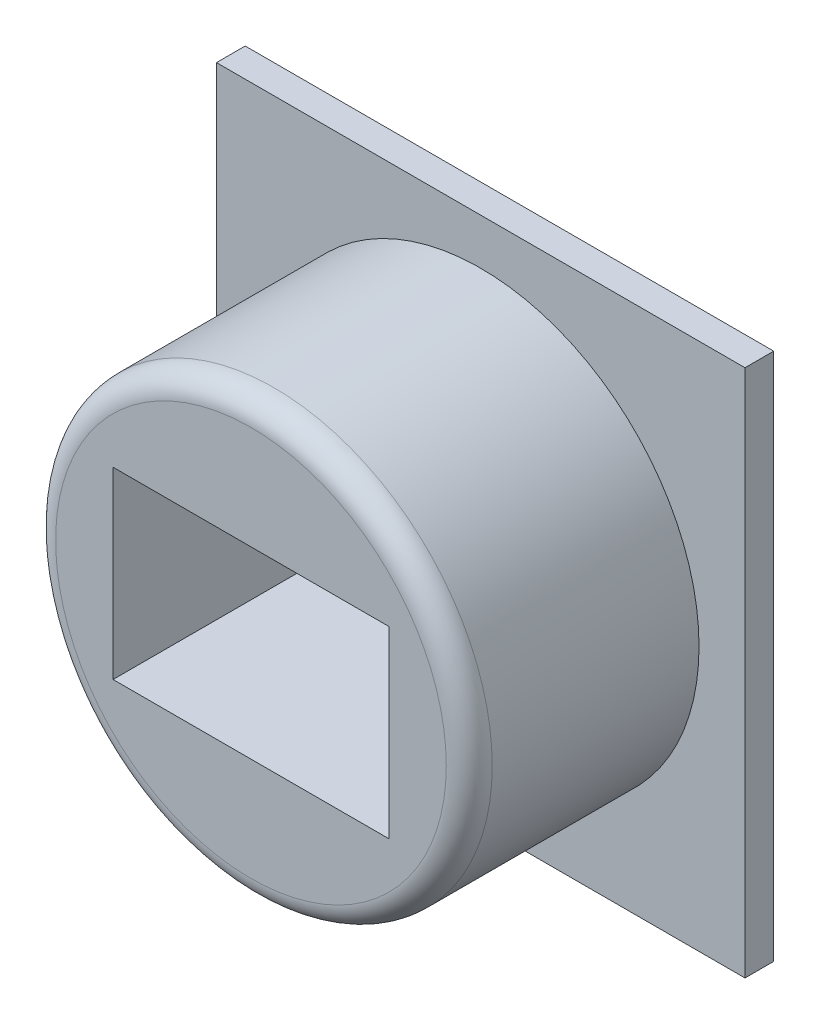
ISO-10303-21;
HEADER;
FILE_DESCRIPTION(('STEP AP214'),'2;1');
FILE_NAME('part.step','',(''),(''),'','','');
FILE_SCHEMA(('AUTOMOTIVE_DESIGN { 1 0 10303 214 1 1 1 1 }'));
ENDSEC;
DATA;
#1=APPLICATION_CONTEXT('core data for automotive mechanical design processes');
#2=APPLICATION_PROTOCOL_DEFINITION('international standard','automotive_design',2000,#1);
#3=PRODUCT_CONTEXT('',#1,'mechanical');
#4=PRODUCT('Part','Part','',(#3));
#5=PRODUCT_RELATED_PRODUCT_CATEGORY('part','',(#4));
#6=PRODUCT_DEFINITION_FORMATION('','',#4);
#7=PRODUCT_DEFINITION_CONTEXT('part definition',#1,'design');
#8=PRODUCT_DEFINITION('design','',#6,#7);
#9=PRODUCT_DEFINITION_SHAPE('','',#8);
#10=(LENGTH_UNIT() NAMED_UNIT(*) SI_UNIT(.MILLI.,.METRE.));
#11=(NAMED_UNIT(*) PLANE_ANGLE_UNIT() SI_UNIT($,.RADIAN.));
#12=(NAMED_UNIT(*) SI_UNIT($,.STERADIAN.) SOLID_ANGLE_UNIT());
#13=UNCERTAINTY_MEASURE_WITH_UNIT(LENGTH_MEASURE(1.E-05),#10,'distance_accuracy_value','');
#14=(GEOMETRIC_REPRESENTATION_CONTEXT(3) GLOBAL_UNCERTAINTY_ASSIGNED_CONTEXT((#13)) GLOBAL_UNIT_ASSIGNED_CONTEXT((#10,
#11,#12)) REPRESENTATION_CONTEXT('',''));
#15=CARTESIAN_POINT('',(0.,0.,0.));
#16=DIRECTION('',(0.,0.,1.));
#17=DIRECTION('',(1.,0.,0.));
#18=AXIS2_PLACEMENT_3D('',#15,#16,#17);
#19=CARTESIAN_POINT('',(0.,0.,4.));
#20=DIRECTION('',(0.,0.,-1.));
#21=DIRECTION('',(-1.,0.,0.));
#22=AXIS2_PLACEMENT_3D('',#19,#20,#21);
#23=CYLINDRICAL_SURFACE('',#22,3.8);
#24=CARTESIAN_POINT('',(0.,0.,3.6));
#25=DIRECTION('',(0.,0.,1.));
#26=DIRECTION('',(1.,0.,0.));
#27=AXIS2_PLACEMENT_3D('',#24,#25,#26);
#28=CIRCLE('',#27,3.8);
#29=CARTESIAN_POINT('',(3.8,0.,3.6));
#30=VERTEX_POINT('',#29);
#31=EDGE_CURVE('E11',#30,#30,#28,.F.);
#32=ORIENTED_EDGE('',*,*,#31,.T.);
#33=EDGE_LOOP('',(#32));
#34=FACE_BOUND('',#33,.T.);
#35=CARTESIAN_POINT('',(0.,0.,0.));
#36=DIRECTION('',(0.,0.,1.));
#37=DIRECTION('',(1.,0.,0.));
#38=AXIS2_PLACEMENT_3D('',#35,#36,#37);
#39=CIRCLE('',#38,3.8);
#40=CARTESIAN_POINT('',(3.8,0.,0.));
#41=VERTEX_POINT('',#40);
#42=EDGE_CURVE('E176',#41,#41,#39,.T.);
#43=ORIENTED_EDGE('',*,*,#42,.T.);
#44=EDGE_LOOP('',(#43));
#45=FACE_BOUND('',#44,.T.);
#46=ADVANCED_FACE('F36',(#34,#45),#23,.T.);
#47=CARTESIAN_POINT('',(0.,0.,4.));
#48=DIRECTION('',(0.,0.,1.));
#49=DIRECTION('',(1.,0.,0.));
#50=AXIS2_PLACEMENT_3D('',#47,#48,#49);
#51=PLANE('',#50);
#52=DIRECTION('',(0.,-1.,0.));
#53=VECTOR('',#52,1.);
#54=CARTESIAN_POINT('',(-2.4,1.6,4.));
#55=LINE('',#54,#53);
#56=CARTESIAN_POINT('',(-2.4,1.6,4.));
#57=VERTEX_POINT('',#56);
#58=CARTESIAN_POINT('',(-2.4,-1.6,4.));
#59=VERTEX_POINT('',#58);
#60=EDGE_CURVE('E51',#57,#59,#55,.T.);
#61=ORIENTED_EDGE('',*,*,#60,.F.);
#62=DIRECTION('',(-1.,0.,0.));
#63=VECTOR('',#62,1.);
#64=CARTESIAN_POINT('',(-2.4,1.6,4.));
#65=LINE('',#64,#63);
#66=CARTESIAN_POINT('',(2.4,1.6,4.));
#67=VERTEX_POINT('',#66);
#68=EDGE_CURVE('E131',#67,#57,#65,.T.);
#69=ORIENTED_EDGE('',*,*,#68,.F.);
#70=DIRECTION('',(0.,1.,0.));
#71=VECTOR('',#70,1.);
#72=CARTESIAN_POINT('',(2.4,1.6,4.));
#73=LINE('',#72,#71);
#74=CARTESIAN_POINT('',(2.4,-1.6,4.));
#75=VERTEX_POINT('',#74);
#76=EDGE_CURVE('E134',#75,#67,#73,.T.);
#77=ORIENTED_EDGE('',*,*,#76,.F.);
#78=DIRECTION('',(1.,0.,0.));
#79=VECTOR('',#78,1.);
#80=CARTESIAN_POINT('',(-2.4,-1.6,4.));
#81=LINE('',#80,#79);
#82=EDGE_CURVE('E143',#59,#75,#81,.T.);
#83=ORIENTED_EDGE('',*,*,#82,.F.);
#84=EDGE_LOOP('',(#61,#69,#77,#83));
#85=FACE_BOUND('',#84,.T.);
#86=CARTESIAN_POINT('',(0.,0.,4.));
#87=DIRECTION('',(0.,0.,1.));
#88=DIRECTION('',(1.,0.,0.));
#89=AXIS2_PLACEMENT_3D('',#86,#87,#88);
#90=CIRCLE('',#89,3.4);
#91=CARTESIAN_POINT('',(3.4,0.,4.));
#92=VERTEX_POINT('',#91);
#93=EDGE_CURVE('E44',#92,#92,#90,.T.);
#94=ORIENTED_EDGE('',*,*,#93,.T.);
#95=EDGE_LOOP('',(#94));
#96=FACE_BOUND('',#95,.T.);
#97=ADVANCED_FACE('F181',(#85,#96),#51,.T.);
#98=CARTESIAN_POINT('',(4.6,4.6,-0.5));
#99=DIRECTION('',(-1.,0.,0.));
#100=DIRECTION('',(0.,-1.,0.));
#101=AXIS2_PLACEMENT_3D('',#98,#99,#100);
#102=PLANE('',#101);
#103=DIRECTION('',(0.,-1.,0.));
#104=VECTOR('',#103,1.);
#105=CARTESIAN_POINT('',(4.6,4.6,0.));
#106=LINE('',#105,#104);
#107=CARTESIAN_POINT('',(4.6,4.6,0.));
#108=VERTEX_POINT('',#107);
#109=CARTESIAN_POINT('',(4.6,-4.6,0.));
#110=VERTEX_POINT('',#109);
#111=EDGE_CURVE('E150',#108,#110,#106,.T.);
#112=ORIENTED_EDGE('',*,*,#111,.T.);
#113=DIRECTION('',(0.,0.,1.));
#114=VECTOR('',#113,1.);
#115=CARTESIAN_POINT('',(4.6,-4.6,-0.5));
#116=LINE('',#115,#114);
#117=CARTESIAN_POINT('',(4.6,-4.6,-0.5));
#118=VERTEX_POINT('',#117);
#119=EDGE_CURVE('E174',#118,#110,#116,.T.);
#120=ORIENTED_EDGE('',*,*,#119,.F.);
#121=DIRECTION('',(0.,-1.,0.));
#122=VECTOR('',#121,1.);
#123=CARTESIAN_POINT('',(4.6,4.6,-0.5));
#124=LINE('',#123,#122);
#125=CARTESIAN_POINT('',(4.6,4.6,-0.5));
#126=VERTEX_POINT('',#125);
#127=EDGE_CURVE('E154',#126,#118,#124,.T.);
#128=ORIENTED_EDGE('',*,*,#127,.F.);
#129=DIRECTION('',(0.,0.,1.));
#130=VECTOR('',#129,1.);
#131=CARTESIAN_POINT('',(4.6,4.6,-0.5));
#132=LINE('',#131,#130);
#133=EDGE_CURVE('E160',#126,#108,#132,.T.);
#134=ORIENTED_EDGE('',*,*,#133,.T.);
#135=EDGE_LOOP('',(#112,#120,#128,#134));
#136=FACE_BOUND('',#135,.T.);
#137=ADVANCED_FACE('F202',(#136),#102,.F.);
#138=CARTESIAN_POINT('',(4.6,-4.6,-0.5));
#139=DIRECTION('',(0.,1.,0.));
#140=DIRECTION('',(0.,0.,1.));
#141=AXIS2_PLACEMENT_3D('',#138,#139,#140);
#142=PLANE('',#141);
#143=DIRECTION('',(-1.,0.,0.));
#144=VECTOR('',#143,1.);
#145=CARTESIAN_POINT('',(4.6,-4.6,0.));
#146=LINE('',#145,#144);
#147=CARTESIAN_POINT('',(-4.6,-4.6,0.));
#148=VERTEX_POINT('',#147);
#149=EDGE_CURVE('E163',#110,#148,#146,.T.);
#150=ORIENTED_EDGE('',*,*,#149,.T.);
#151=DIRECTION('',(0.,0.,1.));
#152=VECTOR('',#151,1.);
#153=CARTESIAN_POINT('',(-4.6,-4.6,-0.5));
#154=LINE('',#153,#152);
#155=CARTESIAN_POINT('',(-4.6,-4.6,-0.5));
#156=VERTEX_POINT('',#155);
#157=EDGE_CURVE('E171',#156,#148,#154,.T.);
#158=ORIENTED_EDGE('',*,*,#157,.F.);
#159=DIRECTION('',(-1.,0.,0.));
#160=VECTOR('',#159,1.);
#161=CARTESIAN_POINT('',(4.6,-4.6,-0.5));
#162=LINE('',#161,#160);
#163=EDGE_CURVE('E89',#118,#156,#162,.T.);
#164=ORIENTED_EDGE('',*,*,#163,.F.);
#165=ORIENTED_EDGE('',*,*,#119,.T.);
#166=EDGE_LOOP('',(#150,#158,#164,#165));
#167=FACE_BOUND('',#166,.T.);
#168=ADVANCED_FACE('F209',(#167),#142,.F.);
#169=CARTESIAN_POINT('',(-4.6,4.6,-0.5));
#170=DIRECTION('',(1.,0.,0.));
#171=DIRECTION('',(0.,1.,0.));
#172=AXIS2_PLACEMENT_3D('',#169,#170,#171);
#173=PLANE('',#172);
#174=DIRECTION('',(0.,1.,0.));
#175=VECTOR('',#174,1.);
#176=CARTESIAN_POINT('',(-4.6,4.6,0.));
#177=LINE('',#176,#175);
#178=CARTESIAN_POINT('',(-4.6,4.6,0.));
#179=VERTEX_POINT('',#178);
#180=EDGE_CURVE('E165',#148,#179,#177,.T.);
#181=ORIENTED_EDGE('',*,*,#180,.T.);
#182=DIRECTION('',(0.,0.,1.));
#183=VECTOR('',#182,1.);
#184=CARTESIAN_POINT('',(-4.6,4.6,-0.5));
#185=LINE('',#184,#183);
#186=CARTESIAN_POINT('',(-4.6,4.6,-0.5));
#187=VERTEX_POINT('',#186);
#188=EDGE_CURVE('E169',#187,#179,#185,.T.);
#189=ORIENTED_EDGE('',*,*,#188,.F.);
#190=DIRECTION('',(0.,1.,0.));
#191=VECTOR('',#190,1.);
#192=CARTESIAN_POINT('',(-4.6,4.6,-0.5));
#193=LINE('',#192,#191);
#194=EDGE_CURVE('E157',#156,#187,#193,.T.);
#195=ORIENTED_EDGE('',*,*,#194,.F.);
#196=ORIENTED_EDGE('',*,*,#157,.T.);
#197=EDGE_LOOP('',(#181,#189,#195,#196));
#198=FACE_BOUND('',#197,.T.);
#199=ADVANCED_FACE('F213',(#198),#173,.F.);
#200=CARTESIAN_POINT('',(4.6,4.6,-0.5));
#201=DIRECTION('',(0.,-1.,0.));
#202=DIRECTION('',(0.,0.,-1.));
#203=AXIS2_PLACEMENT_3D('',#200,#201,#202);
#204=PLANE('',#203);
#205=DIRECTION('',(1.,0.,0.));
#206=VECTOR('',#205,1.);
#207=CARTESIAN_POINT('',(4.6,4.6,0.));
#208=LINE('',#207,#206);
#209=EDGE_CURVE('E81',#179,#108,#208,.T.);
#210=ORIENTED_EDGE('',*,*,#209,.T.);
#211=ORIENTED_EDGE('',*,*,#133,.F.);
#212=DIRECTION('',(1.,0.,0.));
#213=VECTOR('',#212,1.);
#214=CARTESIAN_POINT('',(4.6,4.6,-0.5));
#215=LINE('',#214,#213);
#216=EDGE_CURVE('E60',#187,#126,#215,.T.);
#217=ORIENTED_EDGE('',*,*,#216,.F.);
#218=ORIENTED_EDGE('',*,*,#188,.T.);
#219=EDGE_LOOP('',(#210,#211,#217,#218));
#220=FACE_BOUND('',#219,.T.);
#221=ADVANCED_FACE('F216',(#220),#204,.F.);
#222=CARTESIAN_POINT('',(0.,0.,-0.5));
#223=DIRECTION('',(0.,0.,-1.));
#224=DIRECTION('',(-1.,0.,0.));
#225=AXIS2_PLACEMENT_3D('',#222,#223,#224);
#226=PLANE('',#225);
#227=CARTESIAN_POINT('',(0.,0.,-0.5));
#228=DIRECTION('',(0.,0.,1.));
#229=DIRECTION('',(1.,0.,0.));
#230=AXIS2_PLACEMENT_3D('',#227,#228,#229);
#231=CIRCLE('',#230,0.6);
#232=CARTESIAN_POINT('',(0.6,0.,-0.5));
#233=VERTEX_POINT('',#232);
#234=EDGE_CURVE('E144',#233,#233,#231,.T.);
#235=ORIENTED_EDGE('',*,*,#234,.T.);
#236=EDGE_LOOP('',(#235));
#237=FACE_BOUND('',#236,.T.);
#238=ORIENTED_EDGE('',*,*,#127,.T.);
#239=ORIENTED_EDGE('',*,*,#163,.T.);
#240=ORIENTED_EDGE('',*,*,#194,.T.);
#241=ORIENTED_EDGE('',*,*,#216,.T.);
#242=EDGE_LOOP('',(#238,#239,#240,#241));
#243=FACE_BOUND('',#242,.T.);
#244=ADVANCED_FACE('F192',(#237,#243),#226,.T.);
#245=CARTESIAN_POINT('',(0.,0.,0.));
#246=DIRECTION('',(0.,0.,-1.));
#247=DIRECTION('',(-1.,0.,0.));
#248=AXIS2_PLACEMENT_3D('',#245,#246,#247);
#249=PLANE('',#248);
#250=ORIENTED_EDGE('',*,*,#42,.F.);
#251=EDGE_LOOP('',(#250));
#252=FACE_BOUND('',#251,.T.);
#253=ORIENTED_EDGE('',*,*,#111,.F.);
#254=ORIENTED_EDGE('',*,*,#209,.F.);
#255=ORIENTED_EDGE('',*,*,#180,.F.);
#256=ORIENTED_EDGE('',*,*,#149,.F.);
#257=EDGE_LOOP('',(#253,#254,#255,#256));
#258=FACE_BOUND('',#257,.T.);
#259=ADVANCED_FACE('F184',(#252,#258),#249,.F.);
#260=CARTESIAN_POINT('',(0.,0.,3.6));
#261=DIRECTION('',(0.,0.,1.));
#262=DIRECTION('',(1.,0.,0.));
#263=AXIS2_PLACEMENT_3D('',#260,#261,#262);
#264=TOROIDAL_SURFACE('',#263,3.4,0.4);
#265=ORIENTED_EDGE('',*,*,#31,.F.);
#266=EDGE_LOOP('',(#265));
#267=FACE_BOUND('',#266,.T.);
#268=ORIENTED_EDGE('',*,*,#93,.F.);
#269=EDGE_LOOP('',(#268));
#270=FACE_BOUND('',#269,.T.);
#271=ADVANCED_FACE('F38',(#267,#270),#264,.T.);
#272=CARTESIAN_POINT('',(-2.4,1.6,0.));
#273=DIRECTION('',(-1.,0.,0.));
#274=DIRECTION('',(0.,-1.,0.));
#275=AXIS2_PLACEMENT_3D('',#272,#273,#274);
#276=PLANE('',#275);
#277=ORIENTED_EDGE('',*,*,#60,.T.);
#278=DIRECTION('',(0.,0.,1.));
#279=VECTOR('',#278,1.);
#280=CARTESIAN_POINT('',(-2.4,-1.6,0.));
#281=LINE('',#280,#279);
#282=CARTESIAN_POINT('',(-2.4,-1.6,0.));
#283=VERTEX_POINT('',#282);
#284=EDGE_CURVE('E109',#283,#59,#281,.T.);
#285=ORIENTED_EDGE('',*,*,#284,.F.);
#286=DIRECTION('',(0.,-1.,0.));
#287=VECTOR('',#286,1.);
#288=CARTESIAN_POINT('',(-2.4,1.6,0.));
#289=LINE('',#288,#287);
#290=CARTESIAN_POINT('',(-2.4,1.6,0.));
#291=VERTEX_POINT('',#290);
#292=EDGE_CURVE('E113',#291,#283,#289,.T.);
#293=ORIENTED_EDGE('',*,*,#292,.F.);
#294=DIRECTION('',(0.,0.,1.));
#295=VECTOR('',#294,1.);
#296=CARTESIAN_POINT('',(-2.4,1.6,0.));
#297=LINE('',#296,#295);
#298=EDGE_CURVE('E148',#291,#57,#297,.T.);
#299=ORIENTED_EDGE('',*,*,#298,.T.);
#300=EDGE_LOOP('',(#277,#285,#293,#299));
#301=FACE_BOUND('',#300,.T.);
#302=ADVANCED_FACE('F111',(#301),#276,.F.);
#303=CARTESIAN_POINT('',(-2.4,1.6,0.));
#304=DIRECTION('',(0.,1.,0.));
#305=DIRECTION('',(0.,0.,1.));
#306=AXIS2_PLACEMENT_3D('',#303,#304,#305);
#307=PLANE('',#306);
#308=ORIENTED_EDGE('',*,*,#68,.T.);
#309=ORIENTED_EDGE('',*,*,#298,.F.);
#310=DIRECTION('',(-1.,0.,0.));
#311=VECTOR('',#310,1.);
#312=CARTESIAN_POINT('',(-2.4,1.6,0.));
#313=LINE('',#312,#311);
#314=CARTESIAN_POINT('',(2.4,1.6,0.));
#315=VERTEX_POINT('',#314);
#316=EDGE_CURVE('E119',#315,#291,#313,.T.);
#317=ORIENTED_EDGE('',*,*,#316,.F.);
#318=DIRECTION('',(0.,0.,1.));
#319=VECTOR('',#318,1.);
#320=CARTESIAN_POINT('',(2.4,1.6,0.));
#321=LINE('',#320,#319);
#322=EDGE_CURVE('E151',#315,#67,#321,.T.);
#323=ORIENTED_EDGE('',*,*,#322,.T.);
#324=EDGE_LOOP('',(#308,#309,#317,#323));
#325=FACE_BOUND('',#324,.T.);
#326=ADVANCED_FACE('F190',(#325),#307,.F.);
#327=CARTESIAN_POINT('',(2.4,1.6,0.));
#328=DIRECTION('',(1.,0.,0.));
#329=DIRECTION('',(0.,1.,0.));
#330=AXIS2_PLACEMENT_3D('',#327,#328,#329);
#331=PLANE('',#330);
#332=ORIENTED_EDGE('',*,*,#76,.T.);
#333=ORIENTED_EDGE('',*,*,#322,.F.);
#334=DIRECTION('',(0.,1.,0.));
#335=VECTOR('',#334,1.);
#336=CARTESIAN_POINT('',(2.4,1.6,0.));
#337=LINE('',#336,#335);
#338=CARTESIAN_POINT('',(2.4,-1.6,0.));
#339=VERTEX_POINT('',#338);
#340=EDGE_CURVE('E127',#339,#315,#337,.T.);
#341=ORIENTED_EDGE('',*,*,#340,.F.);
#342=DIRECTION('',(0.,0.,1.));
#343=VECTOR('',#342,1.);
#344=CARTESIAN_POINT('',(2.4,-1.6,0.));
#345=LINE('',#344,#343);
#346=EDGE_CURVE('E118',#339,#75,#345,.T.);
#347=ORIENTED_EDGE('',*,*,#346,.T.);
#348=EDGE_LOOP('',(#332,#333,#341,#347));
#349=FACE_BOUND('',#348,.T.);
#350=ADVANCED_FACE('F225',(#349),#331,.F.);
#351=CARTESIAN_POINT('',(-2.4,-1.6,0.));
#352=DIRECTION('',(0.,-1.,0.));
#353=DIRECTION('',(0.,0.,-1.));
#354=AXIS2_PLACEMENT_3D('',#351,#352,#353);
#355=PLANE('',#354);
#356=ORIENTED_EDGE('',*,*,#82,.T.);
#357=ORIENTED_EDGE('',*,*,#346,.F.);
#358=DIRECTION('',(1.,0.,0.));
#359=VECTOR('',#358,1.);
#360=CARTESIAN_POINT('',(-2.4,-1.6,0.));
#361=LINE('',#360,#359);
#362=EDGE_CURVE('E122',#283,#339,#361,.T.);
#363=ORIENTED_EDGE('',*,*,#362,.F.);
#364=ORIENTED_EDGE('',*,*,#284,.T.);
#365=EDGE_LOOP('',(#356,#357,#363,#364));
#366=FACE_BOUND('',#365,.T.);
#367=ADVANCED_FACE('F123',(#366),#355,.F.);
#368=CARTESIAN_POINT('',(0.,0.,0.));
#369=DIRECTION('',(0.,0.,1.));
#370=DIRECTION('',(1.,0.,0.));
#371=AXIS2_PLACEMENT_3D('',#368,#369,#370);
#372=PLANE('',#371);
#373=CARTESIAN_POINT('',(0.,0.,0.));
#374=DIRECTION('',(0.,0.,1.));
#375=DIRECTION('',(1.,0.,0.));
#376=AXIS2_PLACEMENT_3D('',#373,#374,#375);
#377=CIRCLE('',#376,0.6);
#378=CARTESIAN_POINT('',(0.6,0.,0.));
#379=VERTEX_POINT('',#378);
#380=EDGE_CURVE('E137',#379,#379,#377,.T.);
#381=ORIENTED_EDGE('',*,*,#380,.F.);
#382=EDGE_LOOP('',(#381));
#383=FACE_BOUND('',#382,.T.);
#384=ORIENTED_EDGE('',*,*,#292,.T.);
#385=ORIENTED_EDGE('',*,*,#362,.T.);
#386=ORIENTED_EDGE('',*,*,#340,.T.);
#387=ORIENTED_EDGE('',*,*,#316,.T.);
#388=EDGE_LOOP('',(#384,#385,#386,#387));
#389=FACE_BOUND('',#388,.T.);
#390=ADVANCED_FACE('F129',(#383,#389),#372,.T.);
#391=CARTESIAN_POINT('',(0.,0.,-0.5));
#392=DIRECTION('',(0.,0.,1.));
#393=DIRECTION('',(1.,0.,0.));
#394=AXIS2_PLACEMENT_3D('',#391,#392,#393);
#395=CYLINDRICAL_SURFACE('',#394,0.6);
#396=ORIENTED_EDGE('',*,*,#234,.F.);
#397=EDGE_LOOP('',(#396));
#398=FACE_BOUND('',#397,.T.);
#399=ORIENTED_EDGE('',*,*,#380,.T.);
#400=EDGE_LOOP('',(#399));
#401=FACE_BOUND('',#400,.T.);
#402=ADVANCED_FACE('F234',(#398,#401),#395,.F.);
#403=CLOSED_SHELL('',(#46,#97,#137,#168,#199,#221,#244,#259,#271,#302,#326,#350,#367,#390,#402));
#404=MANIFOLD_SOLID_BREP('B2',#403);
#405=ADVANCED_BREP_SHAPE_REPRESENTATION('',(#18,#404),#14);
#406=SHAPE_DEFINITION_REPRESENTATION(#9,#405);
ENDSEC;
END-ISO-10303-21;
